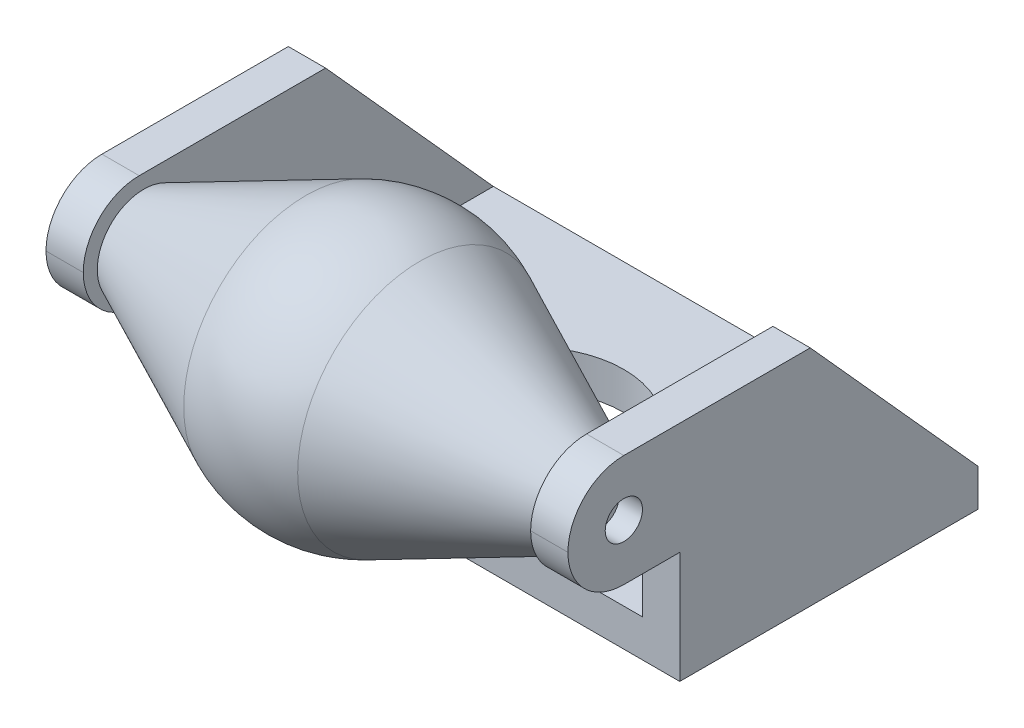
ISO-10303-21;
HEADER;
FILE_DESCRIPTION(('STEP AP214'),'2;1');
FILE_NAME('part.step','',(''),(''),'','','');
FILE_SCHEMA(('AUTOMOTIVE_DESIGN { 1 0 10303 214 1 1 1 1 }'));
ENDSEC;
DATA;
#1=APPLICATION_CONTEXT('core data for automotive mechanical design processes');
#2=APPLICATION_PROTOCOL_DEFINITION('international standard','automotive_design',2000,#1);
#3=PRODUCT_CONTEXT('',#1,'mechanical');
#4=PRODUCT('Part','Part','',(#3));
#5=PRODUCT_RELATED_PRODUCT_CATEGORY('part','',(#4));
#6=PRODUCT_DEFINITION_FORMATION('','',#4);
#7=PRODUCT_DEFINITION_CONTEXT('part definition',#1,'design');
#8=PRODUCT_DEFINITION('design','',#6,#7);
#9=PRODUCT_DEFINITION_SHAPE('','',#8);
#10=(LENGTH_UNIT() NAMED_UNIT(*) SI_UNIT(.MILLI.,.METRE.));
#11=(NAMED_UNIT(*) PLANE_ANGLE_UNIT() SI_UNIT($,.RADIAN.));
#12=(NAMED_UNIT(*) SI_UNIT($,.STERADIAN.) SOLID_ANGLE_UNIT());
#13=UNCERTAINTY_MEASURE_WITH_UNIT(LENGTH_MEASURE(1.E-05),#10,'distance_accuracy_value','');
#14=(GEOMETRIC_REPRESENTATION_CONTEXT(3) GLOBAL_UNCERTAINTY_ASSIGNED_CONTEXT((#13)) GLOBAL_UNIT_ASSIGNED_CONTEXT((#10,
#11,#12)) REPRESENTATION_CONTEXT('',''));
#15=CARTESIAN_POINT('',(0.,0.,0.));
#16=DIRECTION('',(0.,0.,1.));
#17=DIRECTION('',(1.,0.,0.));
#18=AXIS2_PLACEMENT_3D('',#15,#16,#17);
#19=CARTESIAN_POINT('',(-13.25,9.,11.));
#20=DIRECTION('',(1.,0.,0.));
#21=DIRECTION('',(0.,0.,-1.));
#22=AXIS2_PLACEMENT_3D('',#19,#20,#21);
#23=CYLINDRICAL_SURFACE('',#22,1.);
#24=CARTESIAN_POINT('',(12.,9.,11.));
#25=DIRECTION('',(-1.,0.,0.));
#26=DIRECTION('',(0.,0.,1.));
#27=AXIS2_PLACEMENT_3D('',#24,#25,#26);
#28=CIRCLE('',#27,1.);
#29=CARTESIAN_POINT('',(12.,9.,12.));
#30=VERTEX_POINT('',#29);
#31=EDGE_CURVE('E276',#30,#30,#28,.T.);
#32=ORIENTED_EDGE('',*,*,#31,.T.);
#33=EDGE_LOOP('',(#32));
#34=FACE_BOUND('',#33,.T.);
#35=CARTESIAN_POINT('',(11.75,9.,11.));
#36=DIRECTION('',(-1.,0.,0.));
#37=DIRECTION('',(0.,0.,1.));
#38=AXIS2_PLACEMENT_3D('',#35,#36,#37);
#39=CIRCLE('',#38,1.);
#40=CARTESIAN_POINT('',(11.75,9.,12.));
#41=VERTEX_POINT('',#40);
#42=EDGE_CURVE('E43',#41,#41,#39,.F.);
#43=ORIENTED_EDGE('',*,*,#42,.T.);
#44=EDGE_LOOP('',(#43));
#45=FACE_BOUND('',#44,.T.);
#46=ADVANCED_FACE('F39',(#34,#45),#23,.T.);
#47=CARTESIAN_POINT('',(-12.,9.,11.));
#48=DIRECTION('',(1.,0.,0.));
#49=DIRECTION('',(0.,0.,-1.));
#50=AXIS2_PLACEMENT_3D('',#47,#48,#49);
#51=CIRCLE('',#50,1.);
#52=CARTESIAN_POINT('',(-12.,9.,10.));
#53=VERTEX_POINT('',#52);
#54=EDGE_CURVE('E181',#53,#53,#51,.T.);
#55=ORIENTED_EDGE('',*,*,#54,.T.);
#56=EDGE_LOOP('',(#55));
#57=FACE_BOUND('',#56,.T.);
#58=CARTESIAN_POINT('',(-11.75,9.,11.));
#59=DIRECTION('',(1.,0.,0.));
#60=DIRECTION('',(0.,0.,-1.));
#61=AXIS2_PLACEMENT_3D('',#58,#59,#60);
#62=CIRCLE('',#61,1.);
#63=CARTESIAN_POINT('',(-11.75,9.,10.));
#64=VERTEX_POINT('',#63);
#65=EDGE_CURVE('E279',#64,#64,#62,.F.);
#66=ORIENTED_EDGE('',*,*,#65,.T.);
#67=EDGE_LOOP('',(#66));
#68=FACE_BOUND('',#67,.T.);
#69=ADVANCED_FACE('F373',(#57,#68),#23,.T.);
#70=CARTESIAN_POINT('',(14.,9.,11.));
#71=DIRECTION('',(-1.,0.,0.));
#72=DIRECTION('',(0.,0.,1.));
#73=AXIS2_PLACEMENT_3D('',#70,#71,#72);
#74=CYLINDRICAL_SURFACE('',#73,1.);
#75=CARTESIAN_POINT('',(-14.,9.,11.));
#76=DIRECTION('',(-1.,0.,0.));
#77=DIRECTION('',(0.,0.,1.));
#78=AXIS2_PLACEMENT_3D('',#75,#76,#77);
#79=CIRCLE('',#78,1.);
#80=CARTESIAN_POINT('',(-14.,9.,12.));
#81=VERTEX_POINT('',#80);
#82=EDGE_CURVE('E298',#81,#81,#79,.T.);
#83=ORIENTED_EDGE('',*,*,#82,.T.);
#84=EDGE_LOOP('',(#83));
#85=FACE_BOUND('',#84,.T.);
#86=CARTESIAN_POINT('',(-13.25,9.,11.));
#87=DIRECTION('',(1.,0.,0.));
#88=DIRECTION('',(0.,0.,-1.));
#89=AXIS2_PLACEMENT_3D('',#86,#87,#88);
#90=CIRCLE('',#89,1.);
#91=CARTESIAN_POINT('',(-13.25,9.,10.));
#92=VERTEX_POINT('',#91);
#93=EDGE_CURVE('E11',#92,#92,#90,.F.);
#94=ORIENTED_EDGE('',*,*,#93,.F.);
#95=EDGE_LOOP('',(#94));
#96=FACE_BOUND('',#95,.T.);
#97=ADVANCED_FACE('F303',(#85,#96),#74,.F.);
#98=CARTESIAN_POINT('',(14.,2.,8.));
#99=DIRECTION('',(-1.,0.,0.));
#100=DIRECTION('',(0.,0.,1.));
#101=AXIS2_PLACEMENT_3D('',#98,#99,#100);
#102=PLANE('',#101);
#103=CARTESIAN_POINT('',(14.,9.,11.));
#104=DIRECTION('',(-1.,0.,0.));
#105=DIRECTION('',(0.,0.,1.));
#106=AXIS2_PLACEMENT_3D('',#103,#104,#105);
#107=CIRCLE('',#106,1.);
#108=CARTESIAN_POINT('',(14.,9.,12.));
#109=VERTEX_POINT('',#108);
#110=EDGE_CURVE('E278',#109,#109,#107,.T.);
#111=ORIENTED_EDGE('',*,*,#110,.T.);
#112=EDGE_LOOP('',(#111));
#113=FACE_BOUND('',#112,.T.);
#114=CARTESIAN_POINT('',(14.,9.,11.));
#115=DIRECTION('',(-1.,0.,0.));
#116=DIRECTION('',(0.,0.,1.));
#117=AXIS2_PLACEMENT_3D('',#114,#115,#116);
#118=CIRCLE('',#117,3.);
#119=CARTESIAN_POINT('',(14.,12.,11.));
#120=VERTEX_POINT('',#119);
#121=CARTESIAN_POINT('',(14.,9.,14.));
#122=VERTEX_POINT('',#121);
#123=EDGE_CURVE('E248',#120,#122,#118,.F.);
#124=ORIENTED_EDGE('',*,*,#123,.T.);
#125=CARTESIAN_POINT('',(14.,9.,11.));
#126=DIRECTION('',(-1.,0.,0.));
#127=DIRECTION('',(0.,0.,1.));
#128=AXIS2_PLACEMENT_3D('',#125,#126,#127);
#129=CIRCLE('',#128,3.);
#130=CARTESIAN_POINT('',(14.,6.,11.));
#131=VERTEX_POINT('',#130);
#132=EDGE_CURVE('E250',#122,#131,#129,.F.);
#133=ORIENTED_EDGE('',*,*,#132,.T.);
#134=DIRECTION('',(0.,0.,1.));
#135=VECTOR('',#134,1.);
#136=CARTESIAN_POINT('',(14.,6.,14.));
#137=LINE('',#136,#135);
#138=CARTESIAN_POINT('',(14.,6.,8.));
#139=VERTEX_POINT('',#138);
#140=EDGE_CURVE('E176',#139,#131,#137,.T.);
#141=ORIENTED_EDGE('',*,*,#140,.F.);
#142=DIRECTION('',(0.,-1.,0.));
#143=VECTOR('',#142,1.);
#144=CARTESIAN_POINT('',(14.,2.,8.));
#145=LINE('',#144,#143);
#146=CARTESIAN_POINT('',(14.,0.,8.));
#147=VERTEX_POINT('',#146);
#148=EDGE_CURVE('E228',#139,#147,#145,.T.);
#149=ORIENTED_EDGE('',*,*,#148,.T.);
#150=DIRECTION('',(0.,0.,-1.));
#151=VECTOR('',#150,1.);
#152=CARTESIAN_POINT('',(14.,0.,8.));
#153=LINE('',#152,#151);
#154=CARTESIAN_POINT('',(14.,0.,-8.));
#155=VERTEX_POINT('',#154);
#156=EDGE_CURVE('E223',#147,#155,#153,.T.);
#157=ORIENTED_EDGE('',*,*,#156,.T.);
#158=DIRECTION('',(0.,-1.,0.));
#159=VECTOR('',#158,1.);
#160=CARTESIAN_POINT('',(14.,2.,-8.));
#161=LINE('',#160,#159);
#162=CARTESIAN_POINT('',(14.,2.,-8.));
#163=VERTEX_POINT('',#162);
#164=EDGE_CURVE('E245',#163,#155,#161,.T.);
#165=ORIENTED_EDGE('',*,*,#164,.F.);
#166=DIRECTION('',(0.,-0.743294146247166,-0.66896473162245));
#167=VECTOR('',#166,1.);
#168=CARTESIAN_POINT('',(14.,2.,-8.));
#169=LINE('',#168,#167);
#170=CARTESIAN_POINT('',(14.,12.,0.999999999999999));
#171=VERTEX_POINT('',#170);
#172=EDGE_CURVE('E186',#171,#163,#169,.T.);
#173=ORIENTED_EDGE('',*,*,#172,.F.);
#174=DIRECTION('',(0.,0.,-1.));
#175=VECTOR('',#174,1.);
#176=CARTESIAN_POINT('',(14.,12.,0.999999999999999));
#177=LINE('',#176,#175);
#178=EDGE_CURVE('E166',#120,#171,#177,.T.);
#179=ORIENTED_EDGE('',*,*,#178,.F.);
#180=EDGE_LOOP('',(#124,#133,#141,#149,#157,#165,#173,#179));
#181=FACE_BOUND('',#180,.T.);
#182=ADVANCED_FACE('F340',(#113,#181),#102,.F.);
#183=CARTESIAN_POINT('',(-14.,2.,-8.));
#184=DIRECTION('',(0.,0.,1.));
#185=DIRECTION('',(1.,0.,0.));
#186=AXIS2_PLACEMENT_3D('',#183,#184,#185);
#187=PLANE('',#186);
#188=DIRECTION('',(-1.,0.,0.));
#189=VECTOR('',#188,1.);
#190=CARTESIAN_POINT('',(-14.,2.,-8.));
#191=LINE('',#190,#189);
#192=CARTESIAN_POINT('',(12.,2.,-8.));
#193=VERTEX_POINT('',#192);
#194=CARTESIAN_POINT('',(-12.,2.,-8.));
#195=VERTEX_POINT('',#194);
#196=EDGE_CURVE('E226',#193,#195,#191,.T.);
#197=ORIENTED_EDGE('',*,*,#196,.F.);
#198=EDGE_CURVE('E175',#163,#193,#191,.T.);
#199=ORIENTED_EDGE('',*,*,#198,.F.);
#200=ORIENTED_EDGE('',*,*,#164,.T.);
#201=DIRECTION('',(-1.,0.,0.));
#202=VECTOR('',#201,1.);
#203=CARTESIAN_POINT('',(-14.,0.,-8.));
#204=LINE('',#203,#202);
#205=CARTESIAN_POINT('',(-14.,0.,-8.));
#206=VERTEX_POINT('',#205);
#207=EDGE_CURVE('E231',#155,#206,#204,.T.);
#208=ORIENTED_EDGE('',*,*,#207,.T.);
#209=DIRECTION('',(0.,-1.,0.));
#210=VECTOR('',#209,1.);
#211=CARTESIAN_POINT('',(-14.,2.,-8.));
#212=LINE('',#211,#210);
#213=CARTESIAN_POINT('',(-14.,2.,-8.));
#214=VERTEX_POINT('',#213);
#215=EDGE_CURVE('E242',#214,#206,#212,.T.);
#216=ORIENTED_EDGE('',*,*,#215,.F.);
#217=DIRECTION('',(-1.,0.,0.));
#218=VECTOR('',#217,1.);
#219=CARTESIAN_POINT('',(-12.,2.,-8.));
#220=LINE('',#219,#218);
#221=EDGE_CURVE('E213',#195,#214,#220,.T.);
#222=ORIENTED_EDGE('',*,*,#221,.F.);
#223=EDGE_LOOP('',(#197,#199,#200,#208,#216,#222));
#224=FACE_BOUND('',#223,.T.);
#225=ADVANCED_FACE('F310',(#224),#187,.F.);
#226=CARTESIAN_POINT('',(-14.,2.,8.));
#227=DIRECTION('',(1.,0.,0.));
#228=DIRECTION('',(0.,0.,-1.));
#229=AXIS2_PLACEMENT_3D('',#226,#227,#228);
#230=PLANE('',#229);
#231=ORIENTED_EDGE('',*,*,#82,.F.);
#232=EDGE_LOOP('',(#231));
#233=FACE_BOUND('',#232,.T.);
#234=DIRECTION('',(0.,0.,1.));
#235=VECTOR('',#234,1.);
#236=CARTESIAN_POINT('',(-14.,6.,14.));
#237=LINE('',#236,#235);
#238=CARTESIAN_POINT('',(-14.,6.,8.));
#239=VERTEX_POINT('',#238);
#240=CARTESIAN_POINT('',(-14.,6.,11.));
#241=VERTEX_POINT('',#240);
#242=EDGE_CURVE('E194',#239,#241,#237,.T.);
#243=ORIENTED_EDGE('',*,*,#242,.T.);
#244=CARTESIAN_POINT('',(-14.,9.,11.));
#245=DIRECTION('',(1.,0.,0.));
#246=DIRECTION('',(0.,0.,-1.));
#247=AXIS2_PLACEMENT_3D('',#244,#245,#246);
#248=CIRCLE('',#247,3.);
#249=CARTESIAN_POINT('',(-14.,9.,14.));
#250=VERTEX_POINT('',#249);
#251=EDGE_CURVE('E265',#241,#250,#248,.F.);
#252=ORIENTED_EDGE('',*,*,#251,.T.);
#253=CARTESIAN_POINT('',(-14.,9.,11.));
#254=DIRECTION('',(1.,0.,0.));
#255=DIRECTION('',(0.,0.,-1.));
#256=AXIS2_PLACEMENT_3D('',#253,#254,#255);
#257=CIRCLE('',#256,3.);
#258=CARTESIAN_POINT('',(-14.,12.,11.));
#259=VERTEX_POINT('',#258);
#260=EDGE_CURVE('E263',#250,#259,#257,.F.);
#261=ORIENTED_EDGE('',*,*,#260,.T.);
#262=DIRECTION('',(0.,0.,-1.));
#263=VECTOR('',#262,1.);
#264=CARTESIAN_POINT('',(-14.,12.,0.999999999999999));
#265=LINE('',#264,#263);
#266=CARTESIAN_POINT('',(-14.,12.,0.999999999999999));
#267=VERTEX_POINT('',#266);
#268=EDGE_CURVE('E209',#259,#267,#265,.T.);
#269=ORIENTED_EDGE('',*,*,#268,.T.);
#270=DIRECTION('',(0.,-0.743294146247166,-0.66896473162245));
#271=VECTOR('',#270,1.);
#272=CARTESIAN_POINT('',(-14.,2.,-8.));
#273=LINE('',#272,#271);
#274=EDGE_CURVE('E198',#267,#214,#273,.T.);
#275=ORIENTED_EDGE('',*,*,#274,.T.);
#276=ORIENTED_EDGE('',*,*,#215,.T.);
#277=DIRECTION('',(0.,0.,1.));
#278=VECTOR('',#277,1.);
#279=CARTESIAN_POINT('',(-14.,0.,8.));
#280=LINE('',#279,#278);
#281=CARTESIAN_POINT('',(-14.,0.,8.));
#282=VERTEX_POINT('',#281);
#283=EDGE_CURVE('E233',#206,#282,#280,.T.);
#284=ORIENTED_EDGE('',*,*,#283,.T.);
#285=DIRECTION('',(0.,-1.,0.));
#286=VECTOR('',#285,1.);
#287=CARTESIAN_POINT('',(-14.,2.,8.));
#288=LINE('',#287,#286);
#289=EDGE_CURVE('E239',#239,#282,#288,.T.);
#290=ORIENTED_EDGE('',*,*,#289,.F.);
#291=EDGE_LOOP('',(#243,#252,#261,#269,#275,#276,#284,#290));
#292=FACE_BOUND('',#291,.T.);
#293=ADVANCED_FACE('F306',(#233,#292),#230,.F.);
#294=CARTESIAN_POINT('',(-14.,2.,8.));
#295=DIRECTION('',(0.,0.,-1.));
#296=DIRECTION('',(-1.,0.,0.));
#297=AXIS2_PLACEMENT_3D('',#294,#295,#296);
#298=PLANE('',#297);
#299=DIRECTION('',(1.,0.,0.));
#300=VECTOR('',#299,1.);
#301=CARTESIAN_POINT('',(-14.,0.,8.));
#302=LINE('',#301,#300);
#303=EDGE_CURVE('E235',#282,#147,#302,.T.);
#304=ORIENTED_EDGE('',*,*,#303,.T.);
#305=ORIENTED_EDGE('',*,*,#148,.F.);
#306=DIRECTION('',(1.,0.,0.));
#307=VECTOR('',#306,1.);
#308=CARTESIAN_POINT('',(12.,6.,8.));
#309=LINE('',#308,#307);
#310=CARTESIAN_POINT('',(12.,6.,8.));
#311=VERTEX_POINT('',#310);
#312=EDGE_CURVE('E170',#311,#139,#309,.T.);
#313=ORIENTED_EDGE('',*,*,#312,.F.);
#314=DIRECTION('',(0.,1.,0.));
#315=VECTOR('',#314,1.);
#316=CARTESIAN_POINT('',(12.,6.,8.));
#317=LINE('',#316,#315);
#318=CARTESIAN_POINT('',(12.,2.,8.));
#319=VERTEX_POINT('',#318);
#320=EDGE_CURVE('E171',#319,#311,#317,.T.);
#321=ORIENTED_EDGE('',*,*,#320,.F.);
#322=DIRECTION('',(1.,0.,0.));
#323=VECTOR('',#322,1.);
#324=CARTESIAN_POINT('',(-14.,2.,8.));
#325=LINE('',#324,#323);
#326=CARTESIAN_POINT('',(-12.,2.,8.));
#327=VERTEX_POINT('',#326);
#328=EDGE_CURVE('E225',#327,#319,#325,.T.);
#329=ORIENTED_EDGE('',*,*,#328,.F.);
#330=DIRECTION('',(0.,1.,0.));
#331=VECTOR('',#330,1.);
#332=CARTESIAN_POINT('',(-12.,2.,8.));
#333=LINE('',#332,#331);
#334=CARTESIAN_POINT('',(-12.,6.,8.));
#335=VERTEX_POINT('',#334);
#336=EDGE_CURVE('E195',#327,#335,#333,.T.);
#337=ORIENTED_EDGE('',*,*,#336,.T.);
#338=DIRECTION('',(-1.,0.,0.));
#339=VECTOR('',#338,1.);
#340=CARTESIAN_POINT('',(-12.,6.,8.));
#341=LINE('',#340,#339);
#342=EDGE_CURVE('E206',#335,#239,#341,.T.);
#343=ORIENTED_EDGE('',*,*,#342,.T.);
#344=ORIENTED_EDGE('',*,*,#289,.T.);
#345=EDGE_LOOP('',(#304,#305,#313,#321,#329,#337,#343,#344));
#346=FACE_BOUND('',#345,.T.);
#347=ADVANCED_FACE('F309',(#346),#298,.F.);
#348=CARTESIAN_POINT('',(0.,2.,0.));
#349=DIRECTION('',(0.,-1.,0.));
#350=DIRECTION('',(0.,0.,-1.));
#351=AXIS2_PLACEMENT_3D('',#348,#349,#350);
#352=PLANE('',#351);
#353=CARTESIAN_POINT('',(-8.,2.,2.));
#354=DIRECTION('',(0.,-1.,0.));
#355=DIRECTION('',(0.,0.,-1.));
#356=AXIS2_PLACEMENT_3D('',#353,#354,#355);
#357=CIRCLE('',#356,2.);
#358=CARTESIAN_POINT('',(-8.,2.,0.));
#359=VERTEX_POINT('',#358);
#360=EDGE_CURVE('E663',#359,#359,#357,.T.);
#361=ORIENTED_EDGE('',*,*,#360,.T.);
#362=EDGE_LOOP('',(#361));
#363=FACE_BOUND('',#362,.T.);
#364=CARTESIAN_POINT('',(8.,2.,2.));
#365=DIRECTION('',(0.,-1.,0.));
#366=DIRECTION('',(0.,0.,-1.));
#367=AXIS2_PLACEMENT_3D('',#364,#365,#366);
#368=CIRCLE('',#367,2.);
#369=CARTESIAN_POINT('',(8.,2.,0.));
#370=VERTEX_POINT('',#369);
#371=EDGE_CURVE('E667',#370,#370,#368,.T.);
#372=ORIENTED_EDGE('',*,*,#371,.T.);
#373=EDGE_LOOP('',(#372));
#374=FACE_BOUND('',#373,.T.);
#375=CARTESIAN_POINT('',(0.,2.,2.));
#376=DIRECTION('',(0.,-1.,0.));
#377=DIRECTION('',(0.,0.,-1.));
#378=AXIS2_PLACEMENT_3D('',#375,#376,#377);
#379=CIRCLE('',#378,5.);
#380=CARTESIAN_POINT('',(0.,2.,-3.));
#381=VERTEX_POINT('',#380);
#382=EDGE_CURVE('E677',#381,#381,#379,.T.);
#383=ORIENTED_EDGE('',*,*,#382,.T.);
#384=EDGE_LOOP('',(#383));
#385=FACE_BOUND('',#384,.T.);
#386=ORIENTED_EDGE('',*,*,#328,.T.);
#387=DIRECTION('',(0.,0.,-1.));
#388=VECTOR('',#387,1.);
#389=CARTESIAN_POINT('',(12.,2.,0.));
#390=LINE('',#389,#388);
#391=EDGE_CURVE('E191',#319,#193,#390,.T.);
#392=ORIENTED_EDGE('',*,*,#391,.T.);
#393=ORIENTED_EDGE('',*,*,#196,.T.);
#394=DIRECTION('',(0.,0.,1.));
#395=VECTOR('',#394,1.);
#396=CARTESIAN_POINT('',(-12.,2.,0.));
#397=LINE('',#396,#395);
#398=EDGE_CURVE('E216',#195,#327,#397,.T.);
#399=ORIENTED_EDGE('',*,*,#398,.T.);
#400=EDGE_LOOP('',(#386,#392,#393,#399));
#401=FACE_BOUND('',#400,.T.);
#402=ADVANCED_FACE('F355',(#363,#374,#385,#401),#352,.F.);
#403=CARTESIAN_POINT('',(0.,0.,0.));
#404=DIRECTION('',(0.,-1.,0.));
#405=DIRECTION('',(0.,0.,-1.));
#406=AXIS2_PLACEMENT_3D('',#403,#404,#405);
#407=PLANE('',#406);
#408=CARTESIAN_POINT('',(-8.,0.,2.));
#409=DIRECTION('',(0.,-1.,0.));
#410=DIRECTION('',(0.,0.,-1.));
#411=AXIS2_PLACEMENT_3D('',#408,#409,#410);
#412=CIRCLE('',#411,2.);
#413=CARTESIAN_POINT('',(-8.,0.,0.));
#414=VERTEX_POINT('',#413);
#415=EDGE_CURVE('E666',#414,#414,#412,.T.);
#416=ORIENTED_EDGE('',*,*,#415,.F.);
#417=EDGE_LOOP('',(#416));
#418=FACE_BOUND('',#417,.T.);
#419=CARTESIAN_POINT('',(8.,0.,2.));
#420=DIRECTION('',(0.,-1.,0.));
#421=DIRECTION('',(0.,0.,-1.));
#422=AXIS2_PLACEMENT_3D('',#419,#420,#421);
#423=CIRCLE('',#422,2.);
#424=CARTESIAN_POINT('',(8.,0.,0.));
#425=VERTEX_POINT('',#424);
#426=EDGE_CURVE('E672',#425,#425,#423,.T.);
#427=ORIENTED_EDGE('',*,*,#426,.F.);
#428=EDGE_LOOP('',(#427));
#429=FACE_BOUND('',#428,.T.);
#430=CARTESIAN_POINT('',(0.,0.,2.));
#431=DIRECTION('',(0.,-1.,0.));
#432=DIRECTION('',(0.,0.,-1.));
#433=AXIS2_PLACEMENT_3D('',#430,#431,#432);
#434=CIRCLE('',#433,5.);
#435=CARTESIAN_POINT('',(0.,0.,-3.));
#436=VERTEX_POINT('',#435);
#437=EDGE_CURVE('E680',#436,#436,#434,.T.);
#438=ORIENTED_EDGE('',*,*,#437,.F.);
#439=EDGE_LOOP('',(#438));
#440=FACE_BOUND('',#439,.T.);
#441=ORIENTED_EDGE('',*,*,#283,.F.);
#442=ORIENTED_EDGE('',*,*,#207,.F.);
#443=ORIENTED_EDGE('',*,*,#156,.F.);
#444=ORIENTED_EDGE('',*,*,#303,.F.);
#445=EDGE_LOOP('',(#441,#442,#443,#444));
#446=FACE_BOUND('',#445,.T.);
#447=ADVANCED_FACE('F334',(#418,#429,#440,#446),#407,.T.);
#448=CARTESIAN_POINT('',(-12.,0.,0.));
#449=DIRECTION('',(1.,0.,0.));
#450=DIRECTION('',(0.,0.,-1.));
#451=AXIS2_PLACEMENT_3D('',#448,#449,#450);
#452=PLANE('',#451);
#453=ORIENTED_EDGE('',*,*,#54,.F.);
#454=EDGE_LOOP('',(#453));
#455=FACE_BOUND('',#454,.T.);
#456=CARTESIAN_POINT('',(-12.,9.,11.));
#457=DIRECTION('',(1.,0.,0.));
#458=DIRECTION('',(0.,0.,-1.));
#459=AXIS2_PLACEMENT_3D('',#456,#457,#458);
#460=CIRCLE('',#459,3.);
#461=CARTESIAN_POINT('',(-12.,12.,11.));
#462=VERTEX_POINT('',#461);
#463=CARTESIAN_POINT('',(-12.,9.,14.));
#464=VERTEX_POINT('',#463);
#465=EDGE_CURVE('E56',#462,#464,#460,.T.);
#466=ORIENTED_EDGE('',*,*,#465,.T.);
#467=CARTESIAN_POINT('',(-12.,9.,11.));
#468=DIRECTION('',(1.,0.,0.));
#469=DIRECTION('',(0.,0.,-1.));
#470=AXIS2_PLACEMENT_3D('',#467,#468,#469);
#471=CIRCLE('',#470,3.);
#472=CARTESIAN_POINT('',(-12.,6.,11.));
#473=VERTEX_POINT('',#472);
#474=EDGE_CURVE('E268',#464,#473,#471,.T.);
#475=ORIENTED_EDGE('',*,*,#474,.T.);
#476=DIRECTION('',(0.,0.,1.));
#477=VECTOR('',#476,1.);
#478=CARTESIAN_POINT('',(-12.,6.,14.));
#479=LINE('',#478,#477);
#480=EDGE_CURVE('E197',#335,#473,#479,.T.);
#481=ORIENTED_EDGE('',*,*,#480,.F.);
#482=ORIENTED_EDGE('',*,*,#336,.F.);
#483=ORIENTED_EDGE('',*,*,#398,.F.);
#484=DIRECTION('',(0.,-0.743294146247166,-0.66896473162245));
#485=VECTOR('',#484,1.);
#486=CARTESIAN_POINT('',(-12.,2.,-8.));
#487=LINE('',#486,#485);
#488=CARTESIAN_POINT('',(-12.,12.,0.999999999999999));
#489=VERTEX_POINT('',#488);
#490=EDGE_CURVE('E203',#489,#195,#487,.T.);
#491=ORIENTED_EDGE('',*,*,#490,.F.);
#492=DIRECTION('',(0.,0.,-1.));
#493=VECTOR('',#492,1.);
#494=CARTESIAN_POINT('',(-12.,12.,0.999999999999999));
#495=LINE('',#494,#493);
#496=EDGE_CURVE('E201',#462,#489,#495,.T.);
#497=ORIENTED_EDGE('',*,*,#496,.F.);
#498=EDGE_LOOP('',(#466,#475,#481,#482,#483,#491,#497));
#499=FACE_BOUND('',#498,.T.);
#500=ADVANCED_FACE('F359',(#455,#499),#452,.T.);
#501=CARTESIAN_POINT('',(-12.,2.,-8.));
#502=DIRECTION('',(0.,0.66896473162245,-0.743294146247166));
#503=DIRECTION('',(0.,0.743294146247166,0.66896473162245));
#504=AXIS2_PLACEMENT_3D('',#501,#502,#503);
#505=PLANE('',#504);
#506=ORIENTED_EDGE('',*,*,#274,.F.);
#507=DIRECTION('',(-1.,0.,0.));
#508=VECTOR('',#507,1.);
#509=CARTESIAN_POINT('',(-12.,12.,0.999999999999999));
#510=LINE('',#509,#508);
#511=EDGE_CURVE('E217',#489,#267,#510,.T.);
#512=ORIENTED_EDGE('',*,*,#511,.F.);
#513=ORIENTED_EDGE('',*,*,#490,.T.);
#514=ORIENTED_EDGE('',*,*,#221,.T.);
#515=EDGE_LOOP('',(#506,#512,#513,#514));
#516=FACE_BOUND('',#515,.T.);
#517=ADVANCED_FACE('F328',(#516),#505,.T.);
#518=CARTESIAN_POINT('',(-12.,12.,0.999999999999999));
#519=DIRECTION('',(0.,1.,0.));
#520=DIRECTION('',(0.,0.,1.));
#521=AXIS2_PLACEMENT_3D('',#518,#519,#520);
#522=PLANE('',#521);
#523=ORIENTED_EDGE('',*,*,#268,.F.);
#524=DIRECTION('',(-1.,0.,0.));
#525=VECTOR('',#524,1.);
#526=CARTESIAN_POINT('',(-12.,12.,11.));
#527=LINE('',#526,#525);
#528=EDGE_CURVE('E48',#259,#462,#527,.F.);
#529=ORIENTED_EDGE('',*,*,#528,.T.);
#530=ORIENTED_EDGE('',*,*,#496,.T.);
#531=ORIENTED_EDGE('',*,*,#511,.T.);
#532=EDGE_LOOP('',(#523,#529,#530,#531));
#533=FACE_BOUND('',#532,.T.);
#534=ADVANCED_FACE('F323',(#533),#522,.T.);
#535=CARTESIAN_POINT('',(-12.,6.,14.));
#536=DIRECTION('',(0.,-1.,0.));
#537=DIRECTION('',(0.,0.,-1.));
#538=AXIS2_PLACEMENT_3D('',#535,#536,#537);
#539=PLANE('',#538);
#540=ORIENTED_EDGE('',*,*,#480,.T.);
#541=DIRECTION('',(-1.,0.,0.));
#542=VECTOR('',#541,1.);
#543=CARTESIAN_POINT('',(-12.,6.,11.));
#544=LINE('',#543,#542);
#545=EDGE_CURVE('E260',#473,#241,#544,.T.);
#546=ORIENTED_EDGE('',*,*,#545,.T.);
#547=ORIENTED_EDGE('',*,*,#242,.F.);
#548=ORIENTED_EDGE('',*,*,#342,.F.);
#549=EDGE_LOOP('',(#540,#546,#547,#548));
#550=FACE_BOUND('',#549,.T.);
#551=ADVANCED_FACE('F316',(#550),#539,.T.);
#552=CARTESIAN_POINT('',(12.,0.,0.));
#553=DIRECTION('',(-1.,0.,0.));
#554=DIRECTION('',(0.,0.,-1.));
#555=AXIS2_PLACEMENT_3D('',#552,#553,#554);
#556=PLANE('',#555);
#557=ORIENTED_EDGE('',*,*,#31,.F.);
#558=EDGE_LOOP('',(#557));
#559=FACE_BOUND('',#558,.T.);
#560=DIRECTION('',(0.,0.,1.));
#561=VECTOR('',#560,1.);
#562=CARTESIAN_POINT('',(12.,6.,14.));
#563=LINE('',#562,#561);
#564=CARTESIAN_POINT('',(12.,6.,11.));
#565=VERTEX_POINT('',#564);
#566=EDGE_CURVE('E160',#311,#565,#563,.T.);
#567=ORIENTED_EDGE('',*,*,#566,.T.);
#568=CARTESIAN_POINT('',(12.,9.,11.));
#569=DIRECTION('',(-1.,0.,0.));
#570=DIRECTION('',(0.,0.,1.));
#571=AXIS2_PLACEMENT_3D('',#568,#569,#570);
#572=CIRCLE('',#571,3.);
#573=CARTESIAN_POINT('',(12.,9.,14.));
#574=VERTEX_POINT('',#573);
#575=EDGE_CURVE('E256',#565,#574,#572,.T.);
#576=ORIENTED_EDGE('',*,*,#575,.T.);
#577=CARTESIAN_POINT('',(12.,9.,11.));
#578=DIRECTION('',(-1.,0.,0.));
#579=DIRECTION('',(0.,0.,1.));
#580=AXIS2_PLACEMENT_3D('',#577,#578,#579);
#581=CIRCLE('',#580,3.);
#582=CARTESIAN_POINT('',(12.,12.,11.));
#583=VERTEX_POINT('',#582);
#584=EDGE_CURVE('E157',#574,#583,#581,.T.);
#585=ORIENTED_EDGE('',*,*,#584,.T.);
#586=DIRECTION('',(0.,0.,-1.));
#587=VECTOR('',#586,1.);
#588=CARTESIAN_POINT('',(12.,12.,0.999999999999999));
#589=LINE('',#588,#587);
#590=CARTESIAN_POINT('',(12.,12.,0.999999999999999));
#591=VERTEX_POINT('',#590);
#592=EDGE_CURVE('E148',#583,#591,#589,.T.);
#593=ORIENTED_EDGE('',*,*,#592,.T.);
#594=DIRECTION('',(0.,-0.743294146247166,-0.66896473162245));
#595=VECTOR('',#594,1.);
#596=CARTESIAN_POINT('',(12.,2.,-8.));
#597=LINE('',#596,#595);
#598=EDGE_CURVE('E154',#591,#193,#597,.T.);
#599=ORIENTED_EDGE('',*,*,#598,.T.);
#600=ORIENTED_EDGE('',*,*,#391,.F.);
#601=ORIENTED_EDGE('',*,*,#320,.T.);
#602=EDGE_LOOP('',(#567,#576,#585,#593,#599,#600,#601));
#603=FACE_BOUND('',#602,.T.);
#604=ADVANCED_FACE('F151',(#559,#603),#556,.T.);
#605=CARTESIAN_POINT('',(12.,6.,14.));
#606=DIRECTION('',(0.,1.,0.));
#607=DIRECTION('',(0.,0.,1.));
#608=AXIS2_PLACEMENT_3D('',#605,#606,#607);
#609=PLANE('',#608);
#610=ORIENTED_EDGE('',*,*,#140,.T.);
#611=DIRECTION('',(1.,0.,0.));
#612=VECTOR('',#611,1.);
#613=CARTESIAN_POINT('',(12.,6.,11.));
#614=LINE('',#613,#612);
#615=EDGE_CURVE('E252',#131,#565,#614,.F.);
#616=ORIENTED_EDGE('',*,*,#615,.T.);
#617=ORIENTED_EDGE('',*,*,#566,.F.);
#618=ORIENTED_EDGE('',*,*,#312,.T.);
#619=EDGE_LOOP('',(#610,#616,#617,#618));
#620=FACE_BOUND('',#619,.T.);
#621=ADVANCED_FACE('F344',(#620),#609,.F.);
#622=CARTESIAN_POINT('',(12.,12.,0.999999999999999));
#623=DIRECTION('',(0.,-1.,0.));
#624=DIRECTION('',(0.,0.,-1.));
#625=AXIS2_PLACEMENT_3D('',#622,#623,#624);
#626=PLANE('',#625);
#627=ORIENTED_EDGE('',*,*,#592,.F.);
#628=DIRECTION('',(1.,0.,0.));
#629=VECTOR('',#628,1.);
#630=CARTESIAN_POINT('',(12.,12.,11.));
#631=LINE('',#630,#629);
#632=EDGE_CURVE('E258',#583,#120,#631,.T.);
#633=ORIENTED_EDGE('',*,*,#632,.T.);
#634=ORIENTED_EDGE('',*,*,#178,.T.);
#635=DIRECTION('',(1.,0.,0.));
#636=VECTOR('',#635,1.);
#637=CARTESIAN_POINT('',(12.,12.,0.999999999999999));
#638=LINE('',#637,#636);
#639=EDGE_CURVE('E163',#591,#171,#638,.T.);
#640=ORIENTED_EDGE('',*,*,#639,.F.);
#641=EDGE_LOOP('',(#627,#633,#634,#640));
#642=FACE_BOUND('',#641,.T.);
#643=ADVANCED_FACE('F164',(#642),#626,.F.);
#644=CARTESIAN_POINT('',(12.,2.,-8.));
#645=DIRECTION('',(0.,-0.66896473162245,0.743294146247166));
#646=DIRECTION('',(0.,-0.743294146247166,-0.66896473162245));
#647=AXIS2_PLACEMENT_3D('',#644,#645,#646);
#648=PLANE('',#647);
#649=ORIENTED_EDGE('',*,*,#172,.T.);
#650=ORIENTED_EDGE('',*,*,#198,.T.);
#651=ORIENTED_EDGE('',*,*,#598,.F.);
#652=ORIENTED_EDGE('',*,*,#639,.T.);
#653=EDGE_LOOP('',(#649,#650,#651,#652));
#654=FACE_BOUND('',#653,.T.);
#655=ADVANCED_FACE('F173',(#654),#648,.F.);
#656=CARTESIAN_POINT('',(12.,9.,11.));
#657=DIRECTION('',(1.,0.,0.));
#658=DIRECTION('',(0.,0.,-1.));
#659=AXIS2_PLACEMENT_3D('',#656,#657,#658);
#660=CYLINDRICAL_SURFACE('',#659,3.);
#661=ORIENTED_EDGE('',*,*,#632,.F.);
#662=ORIENTED_EDGE('',*,*,#584,.F.);
#663=DIRECTION('',(1.,0.,0.));
#664=VECTOR('',#663,1.);
#665=CARTESIAN_POINT('',(12.,9.,14.));
#666=LINE('',#665,#664);
#667=EDGE_CURVE('E188',#122,#574,#666,.F.);
#668=ORIENTED_EDGE('',*,*,#667,.F.);
#669=ORIENTED_EDGE('',*,*,#123,.F.);
#670=EDGE_LOOP('',(#661,#662,#668,#669));
#671=FACE_BOUND('',#670,.T.);
#672=ADVANCED_FACE('F350',(#671),#660,.T.);
#673=CARTESIAN_POINT('',(12.,9.,11.));
#674=DIRECTION('',(1.,0.,0.));
#675=DIRECTION('',(0.,0.,-1.));
#676=AXIS2_PLACEMENT_3D('',#673,#674,#675);
#677=CYLINDRICAL_SURFACE('',#676,3.);
#678=ORIENTED_EDGE('',*,*,#575,.F.);
#679=ORIENTED_EDGE('',*,*,#615,.F.);
#680=ORIENTED_EDGE('',*,*,#132,.F.);
#681=ORIENTED_EDGE('',*,*,#667,.T.);
#682=EDGE_LOOP('',(#678,#679,#680,#681));
#683=FACE_BOUND('',#682,.T.);
#684=ADVANCED_FACE('F347',(#683),#677,.T.);
#685=CARTESIAN_POINT('',(-12.,9.,11.));
#686=DIRECTION('',(-1.,0.,0.));
#687=DIRECTION('',(0.,0.,1.));
#688=AXIS2_PLACEMENT_3D('',#685,#686,#687);
#689=CYLINDRICAL_SURFACE('',#688,3.);
#690=DIRECTION('',(-1.,0.,0.));
#691=VECTOR('',#690,1.);
#692=CARTESIAN_POINT('',(-12.,9.,14.));
#693=LINE('',#692,#691);
#694=EDGE_CURVE('E273',#464,#250,#693,.T.);
#695=ORIENTED_EDGE('',*,*,#694,.F.);
#696=ORIENTED_EDGE('',*,*,#465,.F.);
#697=ORIENTED_EDGE('',*,*,#528,.F.);
#698=ORIENTED_EDGE('',*,*,#260,.F.);
#699=EDGE_LOOP('',(#695,#696,#697,#698));
#700=FACE_BOUND('',#699,.T.);
#701=ADVANCED_FACE('F41',(#700),#689,.T.);
#702=CARTESIAN_POINT('',(-12.,9.,11.));
#703=DIRECTION('',(-1.,0.,0.));
#704=DIRECTION('',(0.,0.,1.));
#705=AXIS2_PLACEMENT_3D('',#702,#703,#704);
#706=CYLINDRICAL_SURFACE('',#705,3.);
#707=ORIENTED_EDGE('',*,*,#474,.F.);
#708=ORIENTED_EDGE('',*,*,#694,.T.);
#709=ORIENTED_EDGE('',*,*,#251,.F.);
#710=ORIENTED_EDGE('',*,*,#545,.F.);
#711=EDGE_LOOP('',(#707,#708,#709,#710));
#712=FACE_BOUND('',#711,.T.);
#713=ADVANCED_FACE('F321',(#712),#706,.T.);
#714=CARTESIAN_POINT('',(12.75,9.,11.));
#715=DIRECTION('',(1.,0.,0.));
#716=DIRECTION('',(0.,0.,-1.));
#717=AXIS2_PLACEMENT_3D('',#714,#715,#716);
#718=CIRCLE('',#717,1.);
#719=CARTESIAN_POINT('',(12.75,9.,10.));
#720=VERTEX_POINT('',#719);
#721=EDGE_CURVE('E285',#720,#720,#718,.T.);
#722=ORIENTED_EDGE('',*,*,#721,.F.);
#723=EDGE_LOOP('',(#722));
#724=FACE_BOUND('',#723,.T.);
#725=ORIENTED_EDGE('',*,*,#110,.F.);
#726=EDGE_LOOP('',(#725));
#727=FACE_BOUND('',#726,.T.);
#728=ADVANCED_FACE('F385',(#724,#727),#74,.F.);
#729=CARTESIAN_POINT('',(-13.25,9.,11.));
#730=DIRECTION('',(1.,0.,0.));
#731=DIRECTION('',(0.,0.,-1.));
#732=AXIS2_PLACEMENT_3D('',#729,#730,#731);
#733=PLANE('',#732);
#734=ORIENTED_EDGE('',*,*,#93,.T.);
#735=EDGE_LOOP('',(#734));
#736=FACE_BOUND('',#735,.T.);
#737=ADVANCED_FACE('F383',(#736),#733,.F.);
#738=CARTESIAN_POINT('',(12.75,9.,11.));
#739=DIRECTION('',(1.,0.,0.));
#740=DIRECTION('',(0.,0.,-1.));
#741=AXIS2_PLACEMENT_3D('',#738,#739,#740);
#742=PLANE('',#741);
#743=ORIENTED_EDGE('',*,*,#721,.T.);
#744=EDGE_LOOP('',(#743));
#745=FACE_BOUND('',#744,.T.);
#746=ADVANCED_FACE('F582',(#745),#742,.T.);
#747=CARTESIAN_POINT('',(-11.75,9.,11.));
#748=DIRECTION('',(1.,0.,0.));
#749=DIRECTION('',(0.,0.,-1.));
#750=AXIS2_PLACEMENT_3D('',#747,#748,#749);
#751=CONICAL_SURFACE('',#750,2.5,0.436332312998576);
#752=CARTESIAN_POINT('',(-3.05617834699023,9.,11.));
#753=DIRECTION('',(1.,0.,0.));
#754=DIRECTION('',(0.,0.,-1.));
#755=AXIS2_PLACEMENT_3D('',#752,#753,#754);
#756=CIRCLE('',#755,6.55399561543213);
#757=CARTESIAN_POINT('',(-3.05617834699023,9.,17.5539956154321));
#758=VERTEX_POINT('',#757);
#759=EDGE_CURVE('E281',#758,#758,#756,.T.);
#760=ORIENTED_EDGE('',*,*,#759,.F.);
#761=EDGE_LOOP('',(#760));
#762=FACE_BOUND('',#761,.T.);
#763=CARTESIAN_POINT('',(-11.75,9.,11.));
#764=DIRECTION('',(1.,0.,0.));
#765=DIRECTION('',(0.,0.,-1.));
#766=AXIS2_PLACEMENT_3D('',#763,#764,#765);
#767=CIRCLE('',#766,2.5);
#768=CARTESIAN_POINT('',(-11.75,9.,8.5));
#769=VERTEX_POINT('',#768);
#770=EDGE_CURVE('E669',#769,#769,#767,.T.);
#771=ORIENTED_EDGE('',*,*,#770,.T.);
#772=EDGE_LOOP('',(#771));
#773=FACE_BOUND('',#772,.T.);
#774=ADVANCED_FACE('F572',(#762,#773),#751,.T.);
#775=CARTESIAN_POINT('',(0.,9.,11.));
#776=DIRECTION('',(1.,0.,0.));
#777=DIRECTION('',(0.,0.,1.));
#778=AXIS2_PLACEMENT_3D('',#775,#776,#777);
#779=SPHERICAL_SURFACE('',#778,7.23153404304478);
#780=CARTESIAN_POINT('',(3.05617834699023,9.,11.));
#781=DIRECTION('',(1.,0.,0.));
#782=DIRECTION('',(0.,0.,-1.));
#783=AXIS2_PLACEMENT_3D('',#780,#781,#782);
#784=CIRCLE('',#783,6.55399561543213);
#785=CARTESIAN_POINT('',(3.05617834699023,9.,17.5539956154321));
#786=VERTEX_POINT('',#785);
#787=EDGE_CURVE('E287',#786,#786,#784,.T.);
#788=CARTESIAN_POINT('',(3.05617834699023,9.,17.5539956154321));
#789=CARTESIAN_POINT('',(2.99660094100947,9.,17.5817772801324));
#790=CARTESIAN_POINT('',(2.93664453593704,9.,17.6087461519055));
#791=CARTESIAN_POINT('',(2.8160187322853,9.,17.661039218827));
#792=CARTESIAN_POINT('',(2.75534933370598,9.,17.6863634139754));
#793=CARTESIAN_POINT('',(2.63334254771694,9.,17.7353480368772));
#794=CARTESIAN_POINT('',(2.57200516030722,9.,17.7590084646306));
#795=CARTESIAN_POINT('',(2.44870804015404,9.,17.8046480269492));
#796=CARTESIAN_POINT('',(2.3867483074106,9.,17.8266271615144));
#797=CARTESIAN_POINT('',(2.26225256482518,9.,17.868887774143));
#798=CARTESIAN_POINT('',(2.19971655498322,9.,17.8891692522064));
#799=CARTESIAN_POINT('',(2.07411476518397,9.,17.9280194745072));
#800=CARTESIAN_POINT('',(2.0110489852267,9.,17.9465882187446));
#801=CARTESIAN_POINT('',(1.88443455340979,9.,17.9819991634372));
#802=CARTESIAN_POINT('',(1.82088590155017,9.,17.9988413638923));
#803=CARTESIAN_POINT('',(1.69335298396098,9.,18.0307866966952));
#804=CARTESIAN_POINT('',(1.62936871823142,9.,18.0458898290431));
#805=CARTESIAN_POINT('',(1.50101215468226,9.,18.0743457941099));
#806=CARTESIAN_POINT('',(1.43663985686266,9.,18.0876986268289));
#807=CARTESIAN_POINT('',(1.30755509952552,9.,18.1126440628458));
#808=CARTESIAN_POINT('',(1.24284264000797,9.,18.1242366661437));
#809=CARTESIAN_POINT('',(1.11312568261373,9.,18.1456530224862));
#810=CARTESIAN_POINT('',(1.04812118473704,9.,18.1554767755309));
#811=CARTESIAN_POINT('',(0.917868491141091,9.,18.1733481259467));
#812=CARTESIAN_POINT('',(0.852620295421831,9.,18.1813957233179));
#813=CARTESIAN_POINT('',(0.7219287278819,9.,18.1957087778004));
#814=CARTESIAN_POINT('',(0.656485356061228,9.,18.2019742349117));
#815=CARTESIAN_POINT('',(0.52545210320237,9.,18.2127183495749));
#816=CARTESIAN_POINT('',(0.459862222164185,9.,18.2171970071268));
#817=CARTESIAN_POINT('',(0.328584726705529,9.,18.2243641921231));
#818=CARTESIAN_POINT('',(0.262897112285059,9.,18.2270527195674));
#819=CARTESIAN_POINT('',(0.131472998576393,9.,18.2306376450282));
#820=CARTESIAN_POINT('',(0.0657364992881963,9.,18.2315340430448));
#821=CARTESIAN_POINT('',(-0.0657364992881963,9.,18.2315340430448));
#822=CARTESIAN_POINT('',(-0.131472998576393,9.,18.2306376450282));
#823=CARTESIAN_POINT('',(-0.262897112285059,9.,18.2270527195674));
#824=CARTESIAN_POINT('',(-0.328584726705529,9.,18.2243641921231));
#825=CARTESIAN_POINT('',(-0.459862222164185,9.,18.2171970071268));
#826=CARTESIAN_POINT('',(-0.52545210320237,9.,18.2127183495749));
#827=CARTESIAN_POINT('',(-0.656485356061228,9.,18.2019742349117));
#828=CARTESIAN_POINT('',(-0.7219287278819,9.,18.1957087778004));
#829=CARTESIAN_POINT('',(-0.852620295421831,9.,18.1813957233179));
#830=CARTESIAN_POINT('',(-0.917868491141091,9.,18.1733481259467));
#831=CARTESIAN_POINT('',(-1.04812118473704,9.,18.1554767755309));
#832=CARTESIAN_POINT('',(-1.11312568261373,9.,18.1456530224862));
#833=CARTESIAN_POINT('',(-1.24284264000797,9.,18.1242366661437));
#834=CARTESIAN_POINT('',(-1.30755509952552,9.,18.1126440628458));
#835=CARTESIAN_POINT('',(-1.43663985686266,9.,18.0876986268289));
#836=CARTESIAN_POINT('',(-1.50101215468226,9.,18.0743457941099));
#837=CARTESIAN_POINT('',(-1.62936871823142,9.,18.0458898290431));
#838=CARTESIAN_POINT('',(-1.69335298396098,9.,18.0307866966952));
#839=CARTESIAN_POINT('',(-1.82088590155017,9.,17.9988413638923));
#840=CARTESIAN_POINT('',(-1.88443455340979,9.,17.9819991634372));
#841=CARTESIAN_POINT('',(-2.0110489852267,9.,17.9465882187446));
#842=CARTESIAN_POINT('',(-2.07411476518397,9.,17.9280194745072));
#843=CARTESIAN_POINT('',(-2.19971655498322,9.,17.8891692522064));
#844=CARTESIAN_POINT('',(-2.26225256482518,9.,17.868887774143));
#845=CARTESIAN_POINT('',(-2.3867483074106,9.,17.8266271615144));
#846=CARTESIAN_POINT('',(-2.44870804015404,9.,17.8046480269492));
#847=CARTESIAN_POINT('',(-2.57200516030722,9.,17.7590084646306));
#848=CARTESIAN_POINT('',(-2.63334254771694,9.,17.7353480368772));
#849=CARTESIAN_POINT('',(-2.75534933370598,9.,17.6863634139754));
#850=CARTESIAN_POINT('',(-2.8160187322853,9.,17.661039218827));
#851=CARTESIAN_POINT('',(-2.93664453593704,9.,17.6087461519055));
#852=CARTESIAN_POINT('',(-2.99660094100947,9.,17.5817772801324));
#853=CARTESIAN_POINT('',(-3.05617834699023,9.,17.5539956154321));
#854=B_SPLINE_CURVE_WITH_KNOTS('',3,(#788,#789,#790,#791,#792,#793,#794,#795,#796,#797,#798,
#799,#800,#801,#802,#803,#804,#805,#806,#807,#808,#809,#810,#811,#812,#813,#814,#815,#816,#817,
#818,#819,#820,#821,#822,#823,#824,#825,#826,#827,#828,#829,#830,#831,#832,#833,#834,#835,#836,
#837,#838,#839,#840,#841,#842,#843,#844,#845,#846,#847,#848,#849,#850,#851,#852,#853),
.UNSPECIFIED.,.F.,.F.,(4,2,2,2,2,2,2,2,2,2,2,2,2,2,2,2,2,2,2,2,2,2,2,2,2,2,2,2,2,2,2,2,4),(0.,
0.197203387540212,0.394406775080424,0.591610162620637,0.788813550160849,0.98601693770106,
1.18322032524127,1.38042371278148,1.5776271003217,1.77483048786191,1.97203387540212,
2.16923726294233,2.36644065048254,2.56364403802276,2.76084742556297,2.95805081310318,
3.15525420064339,3.3524575881836,3.54966097572382,3.74686436326403,3.94406775080424,
4.14127113834445,4.33847452588467,4.53567791342488,4.73288130096509,4.9300846885053,
5.12728807604551,5.32449146358573,5.52169485112594,5.71889823866615,5.91610162620636,
6.11330501374657,6.31050840128679),.UNSPECIFIED.);
#855=EDGE_CURVE('BSEAM562',#786,#758,#854,.T.);
#856=ORIENTED_EDGE('',*,*,#787,.F.);
#857=ORIENTED_EDGE('',*,*,#759,.T.);
#858=ORIENTED_EDGE('',*,*,#855,.T.);
#859=ORIENTED_EDGE('',*,*,#855,.F.);
#860=EDGE_LOOP('',(#856,#858,#857,#859));
#861=FACE_BOUND('',#860,.T.);
#862=ADVANCED_FACE('F562',(#861),#779,.T.);
#863=CARTESIAN_POINT('',(3.05617834699023,9.,11.));
#864=DIRECTION('',(-1.,0.,0.));
#865=DIRECTION('',(0.,0.,1.));
#866=AXIS2_PLACEMENT_3D('',#863,#864,#865);
#867=CONICAL_SURFACE('',#866,6.55399561543213,0.436332312998576);
#868=CARTESIAN_POINT('',(11.75,9.,11.));
#869=DIRECTION('',(1.,0.,0.));
#870=DIRECTION('',(0.,0.,-1.));
#871=AXIS2_PLACEMENT_3D('',#868,#869,#870);
#872=CIRCLE('',#871,2.49999999999999);
#873=CARTESIAN_POINT('',(11.75,9.,8.50000000000001));
#874=VERTEX_POINT('',#873);
#875=EDGE_CURVE('E292',#874,#874,#872,.T.);
#876=ORIENTED_EDGE('',*,*,#875,.F.);
#877=EDGE_LOOP('',(#876));
#878=FACE_BOUND('',#877,.T.);
#879=ORIENTED_EDGE('',*,*,#787,.T.);
#880=EDGE_LOOP('',(#879));
#881=FACE_BOUND('',#880,.T.);
#882=ADVANCED_FACE('F552',(#878,#881),#867,.T.);
#883=CARTESIAN_POINT('',(11.75,9.,13.5));
#884=DIRECTION('',(-1.,0.,0.));
#885=DIRECTION('',(0.,0.,1.));
#886=AXIS2_PLACEMENT_3D('',#883,#884,#885);
#887=PLANE('',#886);
#888=ORIENTED_EDGE('',*,*,#42,.F.);
#889=EDGE_LOOP('',(#888));
#890=FACE_BOUND('',#889,.T.);
#891=ORIENTED_EDGE('',*,*,#875,.T.);
#892=EDGE_LOOP('',(#891));
#893=FACE_BOUND('',#892,.T.);
#894=ADVANCED_FACE('F540',(#890,#893),#887,.F.);
#895=CARTESIAN_POINT('',(-11.75,9.,11.));
#896=DIRECTION('',(1.,0.,0.));
#897=DIRECTION('',(0.,0.,-1.));
#898=AXIS2_PLACEMENT_3D('',#895,#896,#897);
#899=PLANE('',#898);
#900=ORIENTED_EDGE('',*,*,#65,.F.);
#901=EDGE_LOOP('',(#900));
#902=FACE_BOUND('',#901,.T.);
#903=ORIENTED_EDGE('',*,*,#770,.F.);
#904=EDGE_LOOP('',(#903));
#905=FACE_BOUND('',#904,.T.);
#906=ADVANCED_FACE('F534',(#902,#905),#899,.F.);
#907=CARTESIAN_POINT('',(0.,2.,2.));
#908=DIRECTION('',(0.,-1.,0.));
#909=DIRECTION('',(0.,0.,-1.));
#910=AXIS2_PLACEMENT_3D('',#907,#908,#909);
#911=CYLINDRICAL_SURFACE('',#910,5.);
#912=ORIENTED_EDGE('',*,*,#382,.F.);
#913=EDGE_LOOP('',(#912));
#914=FACE_BOUND('',#913,.T.);
#915=ORIENTED_EDGE('',*,*,#437,.T.);
#916=EDGE_LOOP('',(#915));
#917=FACE_BOUND('',#916,.T.);
#918=ADVANCED_FACE('F539',(#914,#917),#911,.F.);
#919=CARTESIAN_POINT('',(8.,2.,2.));
#920=DIRECTION('',(0.,-1.,0.));
#921=DIRECTION('',(0.,0.,-1.));
#922=AXIS2_PLACEMENT_3D('',#919,#920,#921);
#923=CYLINDRICAL_SURFACE('',#922,2.);
#924=ORIENTED_EDGE('',*,*,#371,.F.);
#925=EDGE_LOOP('',(#924));
#926=FACE_BOUND('',#925,.T.);
#927=ORIENTED_EDGE('',*,*,#426,.T.);
#928=EDGE_LOOP('',(#927));
#929=FACE_BOUND('',#928,.T.);
#930=ADVANCED_FACE('F637',(#926,#929),#923,.F.);
#931=CARTESIAN_POINT('',(-8.,2.,2.));
#932=DIRECTION('',(0.,-1.,0.));
#933=DIRECTION('',(0.,0.,-1.));
#934=AXIS2_PLACEMENT_3D('',#931,#932,#933);
#935=CYLINDRICAL_SURFACE('',#934,2.);
#936=ORIENTED_EDGE('',*,*,#360,.F.);
#937=EDGE_LOOP('',(#936));
#938=FACE_BOUND('',#937,.T.);
#939=ORIENTED_EDGE('',*,*,#415,.T.);
#940=EDGE_LOOP('',(#939));
#941=FACE_BOUND('',#940,.T.);
#942=ADVANCED_FACE('F646',(#938,#941),#935,.F.);
#943=CLOSED_SHELL('',(#46,#69,#97,#182,#225,#293,#347,#402,#447,#500,#517,#534,#551,#604,#621,
#643,#655,#672,#684,#701,#713,#728,#737,#746,#774,#862,#882,#894,#906,#918,#930,#942));
#944=MANIFOLD_SOLID_BREP('B2',#943);
#945=ADVANCED_BREP_SHAPE_REPRESENTATION('',(#18,#944),#14);
#946=SHAPE_DEFINITION_REPRESENTATION(#9,#945);
ENDSEC;
END-ISO-10303-21;
